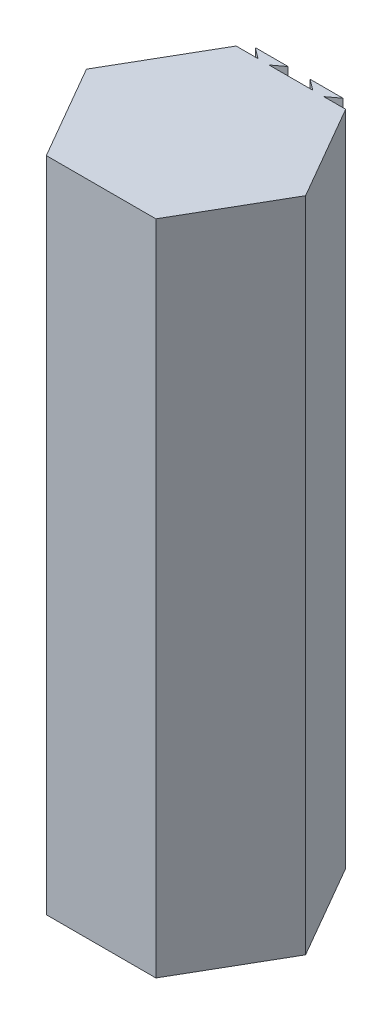
ISO-10303-21;
HEADER;
FILE_DESCRIPTION(('STEP AP214'),'2;1');
FILE_NAME('part.step','',(''),(''),'','','');
FILE_SCHEMA(('AUTOMOTIVE_DESIGN { 1 0 10303 214 1 1 1 1 }'));
ENDSEC;
DATA;
#1=APPLICATION_CONTEXT('core data for automotive mechanical design processes');
#2=APPLICATION_PROTOCOL_DEFINITION('international standard','automotive_design',2000,#1);
#3=PRODUCT_CONTEXT('',#1,'mechanical');
#4=PRODUCT('Part','Part','',(#3));
#5=PRODUCT_RELATED_PRODUCT_CATEGORY('part','',(#4));
#6=PRODUCT_DEFINITION_FORMATION('','',#4);
#7=PRODUCT_DEFINITION_CONTEXT('part definition',#1,'design');
#8=PRODUCT_DEFINITION('design','',#6,#7);
#9=PRODUCT_DEFINITION_SHAPE('','',#8);
#10=(LENGTH_UNIT() NAMED_UNIT(*) SI_UNIT(.MILLI.,.METRE.));
#11=(NAMED_UNIT(*) PLANE_ANGLE_UNIT() SI_UNIT($,.RADIAN.));
#12=(NAMED_UNIT(*) SI_UNIT($,.STERADIAN.) SOLID_ANGLE_UNIT());
#13=UNCERTAINTY_MEASURE_WITH_UNIT(LENGTH_MEASURE(1.E-05),#10,'distance_accuracy_value','');
#14=(GEOMETRIC_REPRESENTATION_CONTEXT(3) GLOBAL_UNCERTAINTY_ASSIGNED_CONTEXT((#13)) GLOBAL_UNIT_ASSIGNED_CONTEXT((#10,
#11,#12)) REPRESENTATION_CONTEXT('',''));
#15=CARTESIAN_POINT('',(0.,0.,0.));
#16=DIRECTION('',(0.,0.,1.));
#17=DIRECTION('',(1.,0.,0.));
#18=AXIS2_PLACEMENT_3D('',#15,#16,#17);
#19=CARTESIAN_POINT('',(-20.,240.,34.6410161513775));
#20=DIRECTION('',(0.,0.,-1.));
#21=DIRECTION('',(-1.,0.,0.));
#22=AXIS2_PLACEMENT_3D('',#19,#20,#21);
#23=PLANE('',#22);
#24=DIRECTION('',(1.,0.,0.));
#25=VECTOR('',#24,1.);
#26=CARTESIAN_POINT('',(-20.,0.,34.6410161513775));
#27=LINE('',#26,#25);
#28=CARTESIAN_POINT('',(-20.,0.,34.6410161513775));
#29=VERTEX_POINT('',#28);
#30=CARTESIAN_POINT('',(20.,0.,34.6410161513776));
#31=VERTEX_POINT('',#30);
#32=EDGE_CURVE('E364',#29,#31,#27,.T.);
#33=ORIENTED_EDGE('',*,*,#32,.T.);
#34=DIRECTION('',(0.,-1.,0.));
#35=VECTOR('',#34,1.);
#36=CARTESIAN_POINT('',(20.,240.,34.6410161513776));
#37=LINE('',#36,#35);
#38=CARTESIAN_POINT('',(20.,240.,34.6410161513776));
#39=VERTEX_POINT('',#38);
#40=EDGE_CURVE('E676',#39,#31,#37,.T.);
#41=ORIENTED_EDGE('',*,*,#40,.F.);
#42=DIRECTION('',(1.,0.,0.));
#43=VECTOR('',#42,1.);
#44=CARTESIAN_POINT('',(-20.,240.,34.6410161513775));
#45=LINE('',#44,#43);
#46=CARTESIAN_POINT('',(-20.,240.,34.6410161513775));
#47=VERTEX_POINT('',#46);
#48=EDGE_CURVE('E681',#47,#39,#45,.T.);
#49=ORIENTED_EDGE('',*,*,#48,.F.);
#50=DIRECTION('',(0.,-1.,0.));
#51=VECTOR('',#50,1.);
#52=CARTESIAN_POINT('',(-20.,240.,34.6410161513775));
#53=LINE('',#52,#51);
#54=EDGE_CURVE('E680',#47,#29,#53,.T.);
#55=ORIENTED_EDGE('',*,*,#54,.T.);
#56=EDGE_LOOP('',(#33,#41,#49,#55));
#57=FACE_BOUND('',#56,.T.);
#58=ADVANCED_FACE('F107',(#57),#23,.F.);
#59=CARTESIAN_POINT('',(-40.,240.,0.));
#60=DIRECTION('',(0.866025403784439,0.,-0.5));
#61=DIRECTION('',(-0.5,0.,-0.866025403784439));
#62=AXIS2_PLACEMENT_3D('',#59,#60,#61);
#63=PLANE('',#62);
#64=DIRECTION('',(0.5,0.,0.866025403784439));
#65=VECTOR('',#64,1.);
#66=CARTESIAN_POINT('',(-40.,0.,0.));
#67=LINE('',#66,#65);
#68=CARTESIAN_POINT('',(-40.,0.,0.));
#69=VERTEX_POINT('',#68);
#70=EDGE_CURVE('E666',#69,#29,#67,.T.);
#71=ORIENTED_EDGE('',*,*,#70,.T.);
#72=ORIENTED_EDGE('',*,*,#54,.F.);
#73=DIRECTION('',(0.5,0.,0.866025403784439));
#74=VECTOR('',#73,1.);
#75=CARTESIAN_POINT('',(-40.,240.,0.));
#76=LINE('',#75,#74);
#77=CARTESIAN_POINT('',(-40.,240.,0.));
#78=VERTEX_POINT('',#77);
#79=EDGE_CURVE('E352',#78,#47,#76,.T.);
#80=ORIENTED_EDGE('',*,*,#79,.F.);
#81=DIRECTION('',(0.,-1.,0.));
#82=VECTOR('',#81,1.);
#83=CARTESIAN_POINT('',(-40.,240.,0.));
#84=LINE('',#83,#82);
#85=EDGE_CURVE('E685',#78,#69,#84,.T.);
#86=ORIENTED_EDGE('',*,*,#85,.T.);
#87=EDGE_LOOP('',(#71,#72,#80,#86));
#88=FACE_BOUND('',#87,.T.);
#89=ADVANCED_FACE('F400',(#88),#63,.F.);
#90=CARTESIAN_POINT('',(20.,240.,34.6410161513776));
#91=DIRECTION('',(-0.866025403784439,0.,-0.5));
#92=DIRECTION('',(-0.5,0.,0.866025403784439));
#93=AXIS2_PLACEMENT_3D('',#90,#91,#92);
#94=PLANE('',#93);
#95=DIRECTION('',(0.5,0.,-0.866025403784439));
#96=VECTOR('',#95,1.);
#97=CARTESIAN_POINT('',(20.,0.,34.6410161513776));
#98=LINE('',#97,#96);
#99=CARTESIAN_POINT('',(40.,0.,0.));
#100=VERTEX_POINT('',#99);
#101=EDGE_CURVE('E323',#31,#100,#98,.T.);
#102=ORIENTED_EDGE('',*,*,#101,.T.);
#103=DIRECTION('',(0.,-1.,0.));
#104=VECTOR('',#103,1.);
#105=CARTESIAN_POINT('',(40.,240.,0.));
#106=LINE('',#105,#104);
#107=CARTESIAN_POINT('',(40.,240.,0.));
#108=VERTEX_POINT('',#107);
#109=EDGE_CURVE('E247',#108,#100,#106,.T.);
#110=ORIENTED_EDGE('',*,*,#109,.F.);
#111=DIRECTION('',(0.5,0.,-0.866025403784439));
#112=VECTOR('',#111,1.);
#113=CARTESIAN_POINT('',(20.,240.,34.6410161513776));
#114=LINE('',#113,#112);
#115=EDGE_CURVE('E362',#39,#108,#114,.T.);
#116=ORIENTED_EDGE('',*,*,#115,.F.);
#117=ORIENTED_EDGE('',*,*,#40,.T.);
#118=EDGE_LOOP('',(#102,#110,#116,#117));
#119=FACE_BOUND('',#118,.T.);
#120=ADVANCED_FACE('F405',(#119),#94,.F.);
#121=CARTESIAN_POINT('',(-20.,240.,-34.6410161513776));
#122=DIRECTION('',(0.866025403784439,0.,0.5));
#123=DIRECTION('',(0.5,0.,-0.866025403784439));
#124=AXIS2_PLACEMENT_3D('',#121,#122,#123);
#125=PLANE('',#124);
#126=DIRECTION('',(-0.5,0.,0.866025403784439));
#127=VECTOR('',#126,1.);
#128=CARTESIAN_POINT('',(-20.,0.,-34.6410161513776));
#129=LINE('',#128,#127);
#130=CARTESIAN_POINT('',(-20.,0.,-34.6410161513776));
#131=VERTEX_POINT('',#130);
#132=EDGE_CURVE('E654',#131,#69,#129,.T.);
#133=ORIENTED_EDGE('',*,*,#132,.T.);
#134=ORIENTED_EDGE('',*,*,#85,.F.);
#135=DIRECTION('',(-0.5,0.,0.866025403784439));
#136=VECTOR('',#135,1.);
#137=CARTESIAN_POINT('',(-20.,240.,-34.6410161513776));
#138=LINE('',#137,#136);
#139=CARTESIAN_POINT('',(-20.,240.,-34.6410161513776));
#140=VERTEX_POINT('',#139);
#141=EDGE_CURVE('E345',#140,#78,#138,.T.);
#142=ORIENTED_EDGE('',*,*,#141,.F.);
#143=DIRECTION('',(0.,-1.,0.));
#144=VECTOR('',#143,1.);
#145=CARTESIAN_POINT('',(-20.,240.,-34.6410161513776));
#146=LINE('',#145,#144);
#147=EDGE_CURVE('E688',#140,#131,#146,.T.);
#148=ORIENTED_EDGE('',*,*,#147,.T.);
#149=EDGE_LOOP('',(#133,#134,#142,#148));
#150=FACE_BOUND('',#149,.T.);
#151=ADVANCED_FACE('F395',(#150),#125,.F.);
#152=CARTESIAN_POINT('',(40.,240.,0.));
#153=DIRECTION('',(-0.866025403784438,0.,0.5));
#154=DIRECTION('',(0.5,0.,0.866025403784439));
#155=AXIS2_PLACEMENT_3D('',#152,#153,#154);
#156=PLANE('',#155);
#157=DIRECTION('',(-0.5,0.,-0.866025403784438));
#158=VECTOR('',#157,1.);
#159=CARTESIAN_POINT('',(40.,0.,0.));
#160=LINE('',#159,#158);
#161=CARTESIAN_POINT('',(20.,0.,-34.6410161513776));
#162=VERTEX_POINT('',#161);
#163=EDGE_CURVE('E656',#100,#162,#160,.T.);
#164=ORIENTED_EDGE('',*,*,#163,.T.);
#165=DIRECTION('',(0.,-1.,0.));
#166=VECTOR('',#165,1.);
#167=CARTESIAN_POINT('',(20.,240.,-34.6410161513776));
#168=LINE('',#167,#166);
#169=CARTESIAN_POINT('',(20.,240.,-34.6410161513776));
#170=VERTEX_POINT('',#169);
#171=EDGE_CURVE('E691',#170,#162,#168,.T.);
#172=ORIENTED_EDGE('',*,*,#171,.F.);
#173=DIRECTION('',(-0.5,0.,-0.866025403784438));
#174=VECTOR('',#173,1.);
#175=CARTESIAN_POINT('',(40.,240.,0.));
#176=LINE('',#175,#174);
#177=EDGE_CURVE('E340',#108,#170,#176,.T.);
#178=ORIENTED_EDGE('',*,*,#177,.F.);
#179=ORIENTED_EDGE('',*,*,#109,.T.);
#180=EDGE_LOOP('',(#164,#172,#178,#179));
#181=FACE_BOUND('',#180,.T.);
#182=ADVANCED_FACE('F386',(#181),#156,.F.);
#183=CARTESIAN_POINT('',(0.,0.,0.));
#184=DIRECTION('',(0.,1.,0.));
#185=DIRECTION('',(0.,0.,1.));
#186=AXIS2_PLACEMENT_3D('',#183,#184,#185);
#187=PLANE('',#186);
#188=CARTESIAN_POINT('',(0.,0.,0.));
#189=DIRECTION('',(0.,-1.,0.));
#190=DIRECTION('',(0.,0.,-1.));
#191=AXIS2_PLACEMENT_3D('',#188,#189,#190);
#192=CIRCLE('',#191,16.);
#193=CARTESIAN_POINT('',(0.,0.,-16.));
#194=VERTEX_POINT('',#193);
#195=EDGE_CURVE('E239',#194,#194,#192,.T.);
#196=ORIENTED_EDGE('',*,*,#195,.F.);
#197=EDGE_LOOP('',(#196));
#198=FACE_BOUND('',#197,.T.);
#199=ORIENTED_EDGE('',*,*,#101,.F.);
#200=ORIENTED_EDGE('',*,*,#32,.F.);
#201=ORIENTED_EDGE('',*,*,#70,.F.);
#202=ORIENTED_EDGE('',*,*,#132,.F.);
#203=DIRECTION('',(-1.,0.,0.));
#204=VECTOR('',#203,1.);
#205=CARTESIAN_POINT('',(20.,0.,-34.6410161513776));
#206=LINE('',#205,#204);
#207=CARTESIAN_POINT('',(-12.,0.,-34.6410161513776));
#208=VERTEX_POINT('',#207);
#209=EDGE_CURVE('E642',#208,#131,#206,.T.);
#210=ORIENTED_EDGE('',*,*,#209,.F.);
#211=DIRECTION('',(0.8,0.,0.6));
#212=VECTOR('',#211,1.);
#213=CARTESIAN_POINT('',(-16.,0.,-37.6410161513775));
#214=LINE('',#213,#212);
#215=CARTESIAN_POINT('',(-16.,0.,-37.6410161513775));
#216=VERTEX_POINT('',#215);
#217=EDGE_CURVE('E644',#216,#208,#214,.T.);
#218=ORIENTED_EDGE('',*,*,#217,.F.);
#219=DIRECTION('',(-1.,0.,0.));
#220=VECTOR('',#219,1.);
#221=CARTESIAN_POINT('',(-4.00000000000002,0.,-37.6410161513776));
#222=LINE('',#221,#220);
#223=CARTESIAN_POINT('',(-4.00000000000002,0.,-37.6410161513776));
#224=VERTEX_POINT('',#223);
#225=EDGE_CURVE('E217',#224,#216,#222,.T.);
#226=ORIENTED_EDGE('',*,*,#225,.F.);
#227=DIRECTION('',(0.8,0.,-0.6));
#228=VECTOR('',#227,1.);
#229=CARTESIAN_POINT('',(-8.00000000000002,0.,-34.6410161513776));
#230=LINE('',#229,#228);
#231=CARTESIAN_POINT('',(-8.00000000000002,0.,-34.6410161513776));
#232=VERTEX_POINT('',#231);
#233=EDGE_CURVE('E649',#232,#224,#230,.T.);
#234=ORIENTED_EDGE('',*,*,#233,.F.);
#235=CARTESIAN_POINT('',(8.,0.,-34.6410161513776));
#236=VERTEX_POINT('',#235);
#237=EDGE_CURVE('E621',#236,#232,#206,.T.);
#238=ORIENTED_EDGE('',*,*,#237,.F.);
#239=DIRECTION('',(-0.8,0.,-0.6));
#240=VECTOR('',#239,1.);
#241=CARTESIAN_POINT('',(8.,0.,-34.6410161513776));
#242=LINE('',#241,#240);
#243=CARTESIAN_POINT('',(4.,0.,-37.6410161513776));
#244=VERTEX_POINT('',#243);
#245=EDGE_CURVE('E235',#236,#244,#242,.T.);
#246=ORIENTED_EDGE('',*,*,#245,.T.);
#247=DIRECTION('',(1.,0.,0.));
#248=VECTOR('',#247,1.);
#249=CARTESIAN_POINT('',(4.,0.,-37.6410161513776));
#250=LINE('',#249,#248);
#251=CARTESIAN_POINT('',(16.,0.,-37.6410161513775));
#252=VERTEX_POINT('',#251);
#253=EDGE_CURVE('E209',#244,#252,#250,.T.);
#254=ORIENTED_EDGE('',*,*,#253,.T.);
#255=DIRECTION('',(-0.8,0.,0.6));
#256=VECTOR('',#255,1.);
#257=CARTESIAN_POINT('',(16.,0.,-37.6410161513775));
#258=LINE('',#257,#256);
#259=CARTESIAN_POINT('',(12.,0.,-34.6410161513776));
#260=VERTEX_POINT('',#259);
#261=EDGE_CURVE('E221',#252,#260,#258,.T.);
#262=ORIENTED_EDGE('',*,*,#261,.T.);
#263=EDGE_CURVE('E658',#162,#260,#206,.T.);
#264=ORIENTED_EDGE('',*,*,#263,.F.);
#265=ORIENTED_EDGE('',*,*,#163,.F.);
#266=EDGE_LOOP('',(#199,#200,#201,#202,#210,#218,#226,#234,#238,#246,#254,#262,#264,#265));
#267=FACE_BOUND('',#266,.T.);
#268=ADVANCED_FACE('F233',(#198,#267),#187,.F.);
#269=CARTESIAN_POINT('',(0.,240.,0.));
#270=DIRECTION('',(0.,1.,0.));
#271=DIRECTION('',(0.,0.,1.));
#272=AXIS2_PLACEMENT_3D('',#269,#270,#271);
#273=PLANE('',#272);
#274=ORIENTED_EDGE('',*,*,#115,.T.);
#275=ORIENTED_EDGE('',*,*,#177,.T.);
#276=DIRECTION('',(-1.,0.,0.));
#277=VECTOR('',#276,1.);
#278=CARTESIAN_POINT('',(20.,240.,-34.6410161513776));
#279=LINE('',#278,#277);
#280=CARTESIAN_POINT('',(12.,240.,-34.6410161513776));
#281=VERTEX_POINT('',#280);
#282=EDGE_CURVE('E335',#170,#281,#279,.T.);
#283=ORIENTED_EDGE('',*,*,#282,.T.);
#284=DIRECTION('',(-0.8,0.,0.6));
#285=VECTOR('',#284,1.);
#286=CARTESIAN_POINT('',(16.,240.,-37.6410161513775));
#287=LINE('',#286,#285);
#288=CARTESIAN_POINT('',(16.,240.,-37.6410161513775));
#289=VERTEX_POINT('',#288);
#290=EDGE_CURVE('E251',#289,#281,#287,.T.);
#291=ORIENTED_EDGE('',*,*,#290,.F.);
#292=DIRECTION('',(1.,0.,0.));
#293=VECTOR('',#292,1.);
#294=CARTESIAN_POINT('',(4.,240.,-37.6410161513776));
#295=LINE('',#294,#293);
#296=CARTESIAN_POINT('',(4.,240.,-37.6410161513776));
#297=VERTEX_POINT('',#296);
#298=EDGE_CURVE('E212',#297,#289,#295,.T.);
#299=ORIENTED_EDGE('',*,*,#298,.F.);
#300=DIRECTION('',(-0.8,0.,-0.6));
#301=VECTOR('',#300,1.);
#302=CARTESIAN_POINT('',(8.,240.,-34.6410161513776));
#303=LINE('',#302,#301);
#304=CARTESIAN_POINT('',(8.,240.,-34.6410161513776));
#305=VERTEX_POINT('',#304);
#306=EDGE_CURVE('E230',#305,#297,#303,.T.);
#307=ORIENTED_EDGE('',*,*,#306,.F.);
#308=CARTESIAN_POINT('',(-8.00000000000002,240.,-34.6410161513776));
#309=VERTEX_POINT('',#308);
#310=EDGE_CURVE('E346',#305,#309,#279,.T.);
#311=ORIENTED_EDGE('',*,*,#310,.T.);
#312=DIRECTION('',(0.8,0.,-0.6));
#313=VECTOR('',#312,1.);
#314=CARTESIAN_POINT('',(-8.00000000000002,240.,-34.6410161513776));
#315=LINE('',#314,#313);
#316=CARTESIAN_POINT('',(-4.00000000000002,240.,-37.6410161513776));
#317=VERTEX_POINT('',#316);
#318=EDGE_CURVE('E623',#309,#317,#315,.T.);
#319=ORIENTED_EDGE('',*,*,#318,.T.);
#320=DIRECTION('',(-1.,0.,0.));
#321=VECTOR('',#320,1.);
#322=CARTESIAN_POINT('',(-4.00000000000002,240.,-37.6410161513776));
#323=LINE('',#322,#321);
#324=CARTESIAN_POINT('',(-16.,240.,-37.6410161513775));
#325=VERTEX_POINT('',#324);
#326=EDGE_CURVE('E697',#317,#325,#323,.T.);
#327=ORIENTED_EDGE('',*,*,#326,.T.);
#328=DIRECTION('',(0.8,0.,0.6));
#329=VECTOR('',#328,1.);
#330=CARTESIAN_POINT('',(-16.,240.,-37.6410161513775));
#331=LINE('',#330,#329);
#332=CARTESIAN_POINT('',(-12.,240.,-34.6410161513776));
#333=VERTEX_POINT('',#332);
#334=EDGE_CURVE('E628',#325,#333,#331,.T.);
#335=ORIENTED_EDGE('',*,*,#334,.T.);
#336=EDGE_CURVE('E348',#333,#140,#279,.T.);
#337=ORIENTED_EDGE('',*,*,#336,.T.);
#338=ORIENTED_EDGE('',*,*,#141,.T.);
#339=ORIENTED_EDGE('',*,*,#79,.T.);
#340=ORIENTED_EDGE('',*,*,#48,.T.);
#341=EDGE_LOOP('',(#274,#275,#283,#291,#299,#307,#311,#319,#327,#335,#337,#338,#339,#340));
#342=FACE_BOUND('',#341,.T.);
#343=ADVANCED_FACE('F337',(#342),#273,.T.);
#344=CARTESIAN_POINT('',(20.,240.,-34.6410161513776));
#345=DIRECTION('',(0.,0.,1.));
#346=DIRECTION('',(1.,0.,0.));
#347=AXIS2_PLACEMENT_3D('',#344,#345,#346);
#348=PLANE('',#347);
#349=DIRECTION('',(0.,-1.,0.));
#350=VECTOR('',#349,1.);
#351=CARTESIAN_POINT('',(-8.00000000000002,240.,-34.6410161513776));
#352=LINE('',#351,#350);
#353=EDGE_CURVE('E305',#309,#232,#352,.T.);
#354=ORIENTED_EDGE('',*,*,#353,.F.);
#355=ORIENTED_EDGE('',*,*,#310,.F.);
#356=DIRECTION('',(0.,-1.,0.));
#357=VECTOR('',#356,1.);
#358=CARTESIAN_POINT('',(8.,240.,-34.6410161513776));
#359=LINE('',#358,#357);
#360=EDGE_CURVE('E243',#305,#236,#359,.T.);
#361=ORIENTED_EDGE('',*,*,#360,.T.);
#362=ORIENTED_EDGE('',*,*,#237,.T.);
#363=EDGE_LOOP('',(#354,#355,#361,#362));
#364=FACE_BOUND('',#363,.T.);
#365=ADVANCED_FACE('F392',(#364),#348,.F.);
#366=DIRECTION('',(0.,-1.,0.));
#367=VECTOR('',#366,1.);
#368=CARTESIAN_POINT('',(12.,240.,-34.6410161513775));
#369=LINE('',#368,#367);
#370=EDGE_CURVE('E225',#281,#260,#369,.T.);
#371=ORIENTED_EDGE('',*,*,#370,.F.);
#372=ORIENTED_EDGE('',*,*,#282,.F.);
#373=ORIENTED_EDGE('',*,*,#171,.T.);
#374=ORIENTED_EDGE('',*,*,#263,.T.);
#375=EDGE_LOOP('',(#371,#372,#373,#374));
#376=FACE_BOUND('',#375,.T.);
#377=ADVANCED_FACE('F415',(#376),#348,.F.);
#378=ORIENTED_EDGE('',*,*,#336,.F.);
#379=DIRECTION('',(0.,-1.,0.));
#380=VECTOR('',#379,1.);
#381=CARTESIAN_POINT('',(-12.,240.,-34.6410161513775));
#382=LINE('',#381,#380);
#383=EDGE_CURVE('E171',#333,#208,#382,.T.);
#384=ORIENTED_EDGE('',*,*,#383,.T.);
#385=ORIENTED_EDGE('',*,*,#209,.T.);
#386=ORIENTED_EDGE('',*,*,#147,.F.);
#387=EDGE_LOOP('',(#378,#384,#385,#386));
#388=FACE_BOUND('',#387,.T.);
#389=ADVANCED_FACE('F413',(#388),#348,.F.);
#390=CARTESIAN_POINT('',(4.,240.,-37.6410161513776));
#391=DIRECTION('',(0.,0.,-1.));
#392=DIRECTION('',(-1.,0.,0.));
#393=AXIS2_PLACEMENT_3D('',#390,#391,#392);
#394=PLANE('',#393);
#395=ORIENTED_EDGE('',*,*,#253,.F.);
#396=DIRECTION('',(0.,-1.,0.));
#397=VECTOR('',#396,1.);
#398=CARTESIAN_POINT('',(4.,240.,-37.6410161513776));
#399=LINE('',#398,#397);
#400=EDGE_CURVE('E200',#297,#244,#399,.T.);
#401=ORIENTED_EDGE('',*,*,#400,.F.);
#402=ORIENTED_EDGE('',*,*,#298,.T.);
#403=DIRECTION('',(0.,-1.,0.));
#404=VECTOR('',#403,1.);
#405=CARTESIAN_POINT('',(16.,240.,-37.6410161513775));
#406=LINE('',#405,#404);
#407=EDGE_CURVE('E205',#289,#252,#406,.T.);
#408=ORIENTED_EDGE('',*,*,#407,.T.);
#409=EDGE_LOOP('',(#395,#401,#402,#408));
#410=FACE_BOUND('',#409,.T.);
#411=ADVANCED_FACE('F207',(#410),#394,.T.);
#412=CARTESIAN_POINT('',(8.,240.,-34.6410161513776));
#413=DIRECTION('',(-0.6,0.,0.8));
#414=DIRECTION('',(0.8,0.,0.6));
#415=AXIS2_PLACEMENT_3D('',#412,#413,#414);
#416=PLANE('',#415);
#417=ORIENTED_EDGE('',*,*,#245,.F.);
#418=ORIENTED_EDGE('',*,*,#360,.F.);
#419=ORIENTED_EDGE('',*,*,#306,.T.);
#420=ORIENTED_EDGE('',*,*,#400,.T.);
#421=EDGE_LOOP('',(#417,#418,#419,#420));
#422=FACE_BOUND('',#421,.T.);
#423=ADVANCED_FACE('F417',(#422),#416,.T.);
#424=CARTESIAN_POINT('',(16.,240.,-37.6410161513775));
#425=DIRECTION('',(0.6,0.,0.8));
#426=DIRECTION('',(0.8,0.,-0.6));
#427=AXIS2_PLACEMENT_3D('',#424,#425,#426);
#428=PLANE('',#427);
#429=ORIENTED_EDGE('',*,*,#261,.F.);
#430=ORIENTED_EDGE('',*,*,#407,.F.);
#431=ORIENTED_EDGE('',*,*,#290,.T.);
#432=ORIENTED_EDGE('',*,*,#370,.T.);
#433=EDGE_LOOP('',(#429,#430,#431,#432));
#434=FACE_BOUND('',#433,.T.);
#435=ADVANCED_FACE('F222',(#434),#428,.T.);
#436=CARTESIAN_POINT('',(-4.00000000000002,240.,-37.6410161513776));
#437=DIRECTION('',(0.,0.,1.));
#438=DIRECTION('',(1.,0.,0.));
#439=AXIS2_PLACEMENT_3D('',#436,#437,#438);
#440=PLANE('',#439);
#441=ORIENTED_EDGE('',*,*,#225,.T.);
#442=DIRECTION('',(0.,-1.,0.));
#443=VECTOR('',#442,1.);
#444=CARTESIAN_POINT('',(-16.,240.,-37.6410161513775));
#445=LINE('',#444,#443);
#446=EDGE_CURVE('E319',#325,#216,#445,.T.);
#447=ORIENTED_EDGE('',*,*,#446,.F.);
#448=ORIENTED_EDGE('',*,*,#326,.F.);
#449=DIRECTION('',(0.,-1.,0.));
#450=VECTOR('',#449,1.);
#451=CARTESIAN_POINT('',(-4.00000000000002,240.,-37.6410161513776));
#452=LINE('',#451,#450);
#453=EDGE_CURVE('E316',#317,#224,#452,.T.);
#454=ORIENTED_EDGE('',*,*,#453,.T.);
#455=EDGE_LOOP('',(#441,#447,#448,#454));
#456=FACE_BOUND('',#455,.T.);
#457=ADVANCED_FACE('F427',(#456),#440,.F.);
#458=CARTESIAN_POINT('',(-16.,240.,-37.6410161513775));
#459=DIRECTION('',(0.6,0.,-0.8));
#460=DIRECTION('',(-0.8,0.,-0.6));
#461=AXIS2_PLACEMENT_3D('',#458,#459,#460);
#462=PLANE('',#461);
#463=ORIENTED_EDGE('',*,*,#217,.T.);
#464=ORIENTED_EDGE('',*,*,#383,.F.);
#465=ORIENTED_EDGE('',*,*,#334,.F.);
#466=ORIENTED_EDGE('',*,*,#446,.T.);
#467=EDGE_LOOP('',(#463,#464,#465,#466));
#468=FACE_BOUND('',#467,.T.);
#469=ADVANCED_FACE('F424',(#468),#462,.F.);
#470=CARTESIAN_POINT('',(-8.00000000000002,240.,-34.6410161513776));
#471=DIRECTION('',(-0.6,0.,-0.8));
#472=DIRECTION('',(-0.8,0.,0.6));
#473=AXIS2_PLACEMENT_3D('',#470,#471,#472);
#474=PLANE('',#473);
#475=ORIENTED_EDGE('',*,*,#233,.T.);
#476=ORIENTED_EDGE('',*,*,#453,.F.);
#477=ORIENTED_EDGE('',*,*,#318,.F.);
#478=ORIENTED_EDGE('',*,*,#353,.T.);
#479=EDGE_LOOP('',(#475,#476,#477,#478));
#480=FACE_BOUND('',#479,.T.);
#481=ADVANCED_FACE('F381',(#480),#474,.F.);
#482=CARTESIAN_POINT('',(0.,240.001,0.));
#483=DIRECTION('',(0.,-1.,0.));
#484=DIRECTION('',(0.,0.,-1.));
#485=AXIS2_PLACEMENT_3D('',#482,#483,#484);
#486=CYLINDRICAL_SURFACE('',#485,16.);
#487=CARTESIAN_POINT('',(0.,8.00000000000001,0.));
#488=DIRECTION('',(0.,1.,0.));
#489=DIRECTION('',(0.,0.,1.));
#490=AXIS2_PLACEMENT_3D('',#487,#488,#489);
#491=CIRCLE('',#490,16.);
#492=CARTESIAN_POINT('',(0.,8.00000000000001,16.));
#493=VERTEX_POINT('',#492);
#494=EDGE_CURVE('E370',#493,#493,#491,.F.);
#495=ORIENTED_EDGE('',*,*,#494,.F.);
#496=EDGE_LOOP('',(#495));
#497=FACE_BOUND('',#496,.T.);
#498=ORIENTED_EDGE('',*,*,#195,.T.);
#499=EDGE_LOOP('',(#498));
#500=FACE_BOUND('',#499,.T.);
#501=ADVANCED_FACE('F377',(#497,#500),#486,.F.);
#502=CARTESIAN_POINT('',(-20.,240.,30.6410161513775));
#503=DIRECTION('',(0.,0.,-1.));
#504=DIRECTION('',(-1.,0.,0.));
#505=AXIS2_PLACEMENT_3D('',#502,#503,#504);
#506=PLANE('',#505);
#507=DIRECTION('',(1.,0.,0.));
#508=VECTOR('',#507,1.);
#509=CARTESIAN_POINT('',(-20.,8.00000000000001,30.6410161513775));
#510=LINE('',#509,#508);
#511=CARTESIAN_POINT('',(-17.6905989232415,8.,30.6410161513775));
#512=VERTEX_POINT('',#511);
#513=CARTESIAN_POINT('',(17.6905989232415,8.,30.6410161513776));
#514=VERTEX_POINT('',#513);
#515=EDGE_CURVE('E111',#512,#514,#510,.T.);
#516=ORIENTED_EDGE('',*,*,#515,.F.);
#517=DIRECTION('',(0.,-1.,0.));
#518=VECTOR('',#517,1.);
#519=CARTESIAN_POINT('',(-17.6905989232415,240.,30.6410161513775));
#520=LINE('',#519,#518);
#521=CARTESIAN_POINT('',(-17.6905989232415,236.,30.6410161513775));
#522=VERTEX_POINT('',#521);
#523=EDGE_CURVE('E300',#522,#512,#520,.T.);
#524=ORIENTED_EDGE('',*,*,#523,.F.);
#525=DIRECTION('',(1.,0.,0.));
#526=VECTOR('',#525,1.);
#527=CARTESIAN_POINT('',(-20.,236.,30.6410161513775));
#528=LINE('',#527,#526);
#529=CARTESIAN_POINT('',(17.6905989232415,236.,30.6410161513776));
#530=VERTEX_POINT('',#529);
#531=EDGE_CURVE('E260',#522,#530,#528,.T.);
#532=ORIENTED_EDGE('',*,*,#531,.T.);
#533=DIRECTION('',(0.,-1.,0.));
#534=VECTOR('',#533,1.);
#535=CARTESIAN_POINT('',(17.6905989232415,240.,30.6410161513776));
#536=LINE('',#535,#534);
#537=EDGE_CURVE('E289',#530,#514,#536,.T.);
#538=ORIENTED_EDGE('',*,*,#537,.T.);
#539=EDGE_LOOP('',(#516,#524,#532,#538));
#540=FACE_BOUND('',#539,.T.);
#541=ADVANCED_FACE('F380',(#540),#506,.T.);
#542=CARTESIAN_POINT('',(-36.5358983848623,240.,-1.99999999999999));
#543=DIRECTION('',(0.866025403784439,0.,-0.5));
#544=DIRECTION('',(-0.5,0.,-0.866025403784439));
#545=AXIS2_PLACEMENT_3D('',#542,#543,#544);
#546=PLANE('',#545);
#547=DIRECTION('',(0.5,0.,0.866025403784439));
#548=VECTOR('',#547,1.);
#549=CARTESIAN_POINT('',(-36.5358983848623,8.00000000000001,-1.99999999999999));
#550=LINE('',#549,#548);
#551=CARTESIAN_POINT('',(-35.381197846483,8.,0.));
#552=VERTEX_POINT('',#551);
#553=EDGE_CURVE('E158',#552,#512,#550,.T.);
#554=ORIENTED_EDGE('',*,*,#553,.F.);
#555=DIRECTION('',(0.,-1.,0.));
#556=VECTOR('',#555,1.);
#557=CARTESIAN_POINT('',(-35.381197846483,240.,0.));
#558=LINE('',#557,#556);
#559=CARTESIAN_POINT('',(-35.381197846483,236.,0.));
#560=VERTEX_POINT('',#559);
#561=EDGE_CURVE('E295',#560,#552,#558,.T.);
#562=ORIENTED_EDGE('',*,*,#561,.F.);
#563=DIRECTION('',(0.5,0.,0.866025403784439));
#564=VECTOR('',#563,1.);
#565=CARTESIAN_POINT('',(-36.5358983848623,236.,-1.99999999999999));
#566=LINE('',#565,#564);
#567=EDGE_CURVE('E263',#560,#522,#566,.T.);
#568=ORIENTED_EDGE('',*,*,#567,.T.);
#569=ORIENTED_EDGE('',*,*,#523,.T.);
#570=EDGE_LOOP('',(#554,#562,#568,#569));
#571=FACE_BOUND('',#570,.T.);
#572=ADVANCED_FACE('F439',(#571),#546,.T.);
#573=CARTESIAN_POINT('',(16.5358983848623,240.,32.6410161513775));
#574=DIRECTION('',(-0.866025403784439,0.,-0.5));
#575=DIRECTION('',(-0.5,0.,0.866025403784439));
#576=AXIS2_PLACEMENT_3D('',#573,#574,#575);
#577=PLANE('',#576);
#578=DIRECTION('',(0.5,0.,-0.866025403784439));
#579=VECTOR('',#578,1.);
#580=CARTESIAN_POINT('',(16.5358983848623,8.00000000000001,32.6410161513775));
#581=LINE('',#580,#579);
#582=CARTESIAN_POINT('',(35.381197846483,8.,0.));
#583=VERTEX_POINT('',#582);
#584=EDGE_CURVE('E292',#514,#583,#581,.T.);
#585=ORIENTED_EDGE('',*,*,#584,.F.);
#586=ORIENTED_EDGE('',*,*,#537,.F.);
#587=DIRECTION('',(0.5,0.,-0.866025403784439));
#588=VECTOR('',#587,1.);
#589=CARTESIAN_POINT('',(16.5358983848623,236.,32.6410161513775));
#590=LINE('',#589,#588);
#591=CARTESIAN_POINT('',(35.381197846483,236.,0.));
#592=VERTEX_POINT('',#591);
#593=EDGE_CURVE('E256',#530,#592,#590,.T.);
#594=ORIENTED_EDGE('',*,*,#593,.T.);
#595=DIRECTION('',(0.,-1.,0.));
#596=VECTOR('',#595,1.);
#597=CARTESIAN_POINT('',(35.381197846483,240.,0.));
#598=LINE('',#597,#596);
#599=EDGE_CURVE('E276',#592,#583,#598,.T.);
#600=ORIENTED_EDGE('',*,*,#599,.T.);
#601=EDGE_LOOP('',(#585,#586,#594,#600));
#602=FACE_BOUND('',#601,.T.);
#603=ADVANCED_FACE('F443',(#602),#577,.T.);
#604=CARTESIAN_POINT('',(-16.5358983848623,240.,-32.6410161513776));
#605=DIRECTION('',(0.866025403784439,0.,0.5));
#606=DIRECTION('',(0.5,0.,-0.866025403784439));
#607=AXIS2_PLACEMENT_3D('',#604,#605,#606);
#608=PLANE('',#607);
#609=DIRECTION('',(-0.5,0.,0.866025403784439));
#610=VECTOR('',#609,1.);
#611=CARTESIAN_POINT('',(-16.5358983848623,8.00000000000001,-32.6410161513776));
#612=LINE('',#611,#610);
#613=CARTESIAN_POINT('',(-17.6905989232415,8.,-30.6410161513776));
#614=VERTEX_POINT('',#613);
#615=EDGE_CURVE('E286',#614,#552,#612,.T.);
#616=ORIENTED_EDGE('',*,*,#615,.F.);
#617=DIRECTION('',(0.,-1.,0.));
#618=VECTOR('',#617,1.);
#619=CARTESIAN_POINT('',(-17.6905989232415,240.,-30.6410161513776));
#620=LINE('',#619,#618);
#621=CARTESIAN_POINT('',(-17.6905989232415,236.,-30.6410161513776));
#622=VERTEX_POINT('',#621);
#623=EDGE_CURVE('E283',#622,#614,#620,.T.);
#624=ORIENTED_EDGE('',*,*,#623,.F.);
#625=DIRECTION('',(-0.5,0.,0.866025403784439));
#626=VECTOR('',#625,1.);
#627=CARTESIAN_POINT('',(-16.5358983848623,236.,-32.6410161513776));
#628=LINE('',#627,#626);
#629=EDGE_CURVE('E266',#622,#560,#628,.T.);
#630=ORIENTED_EDGE('',*,*,#629,.T.);
#631=ORIENTED_EDGE('',*,*,#561,.T.);
#632=EDGE_LOOP('',(#616,#624,#630,#631));
#633=FACE_BOUND('',#632,.T.);
#634=ADVANCED_FACE('F446',(#633),#608,.T.);
#635=CARTESIAN_POINT('',(36.5358983848622,240.,2.));
#636=DIRECTION('',(-0.866025403784438,0.,0.5));
#637=DIRECTION('',(0.5,0.,0.866025403784439));
#638=AXIS2_PLACEMENT_3D('',#635,#636,#637);
#639=PLANE('',#638);
#640=DIRECTION('',(-0.5,0.,-0.866025403784439));
#641=VECTOR('',#640,1.);
#642=CARTESIAN_POINT('',(36.5358983848622,8.00000000000001,2.));
#643=LINE('',#642,#641);
#644=CARTESIAN_POINT('',(17.6905989232415,8.00000000000001,-30.6410161513776));
#645=VERTEX_POINT('',#644);
#646=EDGE_CURVE('E280',#583,#645,#643,.T.);
#647=ORIENTED_EDGE('',*,*,#646,.F.);
#648=ORIENTED_EDGE('',*,*,#599,.F.);
#649=DIRECTION('',(-0.5,0.,-0.866025403784439));
#650=VECTOR('',#649,1.);
#651=CARTESIAN_POINT('',(36.5358983848622,236.,2.));
#652=LINE('',#651,#650);
#653=CARTESIAN_POINT('',(17.6905989232415,236.,-30.6410161513776));
#654=VERTEX_POINT('',#653);
#655=EDGE_CURVE('E272',#592,#654,#652,.T.);
#656=ORIENTED_EDGE('',*,*,#655,.T.);
#657=DIRECTION('',(0.,-1.,0.));
#658=VECTOR('',#657,1.);
#659=CARTESIAN_POINT('',(17.6905989232415,240.,-30.6410161513776));
#660=LINE('',#659,#658);
#661=EDGE_CURVE('E118',#654,#645,#660,.T.);
#662=ORIENTED_EDGE('',*,*,#661,.T.);
#663=EDGE_LOOP('',(#647,#648,#656,#662));
#664=FACE_BOUND('',#663,.T.);
#665=ADVANCED_FACE('F450',(#664),#639,.T.);
#666=CARTESIAN_POINT('',(0.,8.,0.));
#667=DIRECTION('',(0.,1.,0.));
#668=DIRECTION('',(0.,0.,1.));
#669=AXIS2_PLACEMENT_3D('',#666,#667,#668);
#670=PLANE('',#669);
#671=ORIENTED_EDGE('',*,*,#494,.T.);
#672=EDGE_LOOP('',(#671));
#673=FACE_BOUND('',#672,.T.);
#674=ORIENTED_EDGE('',*,*,#615,.T.);
#675=ORIENTED_EDGE('',*,*,#553,.T.);
#676=ORIENTED_EDGE('',*,*,#515,.T.);
#677=ORIENTED_EDGE('',*,*,#584,.T.);
#678=ORIENTED_EDGE('',*,*,#646,.T.);
#679=DIRECTION('',(-1.,0.,0.));
#680=VECTOR('',#679,1.);
#681=CARTESIAN_POINT('',(20.,8.00000000000001,-30.6410161513776));
#682=LINE('',#681,#680);
#683=EDGE_CURVE('E12',#645,#614,#682,.T.);
#684=ORIENTED_EDGE('',*,*,#683,.T.);
#685=EDGE_LOOP('',(#674,#675,#676,#677,#678,#684));
#686=FACE_BOUND('',#685,.T.);
#687=ADVANCED_FACE('F375',(#673,#686),#670,.T.);
#688=CARTESIAN_POINT('',(0.,236.,0.));
#689=DIRECTION('',(0.,1.,0.));
#690=DIRECTION('',(0.,0.,1.));
#691=AXIS2_PLACEMENT_3D('',#688,#689,#690);
#692=PLANE('',#691);
#693=ORIENTED_EDGE('',*,*,#655,.F.);
#694=ORIENTED_EDGE('',*,*,#593,.F.);
#695=ORIENTED_EDGE('',*,*,#531,.F.);
#696=ORIENTED_EDGE('',*,*,#567,.F.);
#697=ORIENTED_EDGE('',*,*,#629,.F.);
#698=DIRECTION('',(-1.,0.,0.));
#699=VECTOR('',#698,1.);
#700=CARTESIAN_POINT('',(20.,236.,-30.6410161513776));
#701=LINE('',#700,#699);
#702=EDGE_CURVE('E269',#654,#622,#701,.T.);
#703=ORIENTED_EDGE('',*,*,#702,.F.);
#704=EDGE_LOOP('',(#693,#694,#695,#696,#697,#703));
#705=FACE_BOUND('',#704,.T.);
#706=ADVANCED_FACE('F456',(#705),#692,.F.);
#707=CARTESIAN_POINT('',(20.,240.,-30.6410161513776));
#708=DIRECTION('',(0.,0.,1.));
#709=DIRECTION('',(1.,0.,0.));
#710=AXIS2_PLACEMENT_3D('',#707,#708,#709);
#711=PLANE('',#710);
#712=ORIENTED_EDGE('',*,*,#623,.T.);
#713=ORIENTED_EDGE('',*,*,#683,.F.);
#714=ORIENTED_EDGE('',*,*,#661,.F.);
#715=ORIENTED_EDGE('',*,*,#702,.T.);
#716=EDGE_LOOP('',(#712,#713,#714,#715));
#717=FACE_BOUND('',#716,.T.);
#718=ADVANCED_FACE('F109',(#717),#711,.T.);
#719=CLOSED_SHELL('',(#58,#89,#120,#151,#182,#268,#343,#365,#377,#389,#411,#423,#435,#457,#469,
#481,#501,#541,#572,#603,#634,#665,#687,#706,#718));
#720=MANIFOLD_SOLID_BREP('B2',#719);
#721=ADVANCED_BREP_SHAPE_REPRESENTATION('',(#18,#720),#14);
#722=SHAPE_DEFINITION_REPRESENTATION(#9,#721);
ENDSEC;
END-ISO-10303-21;
